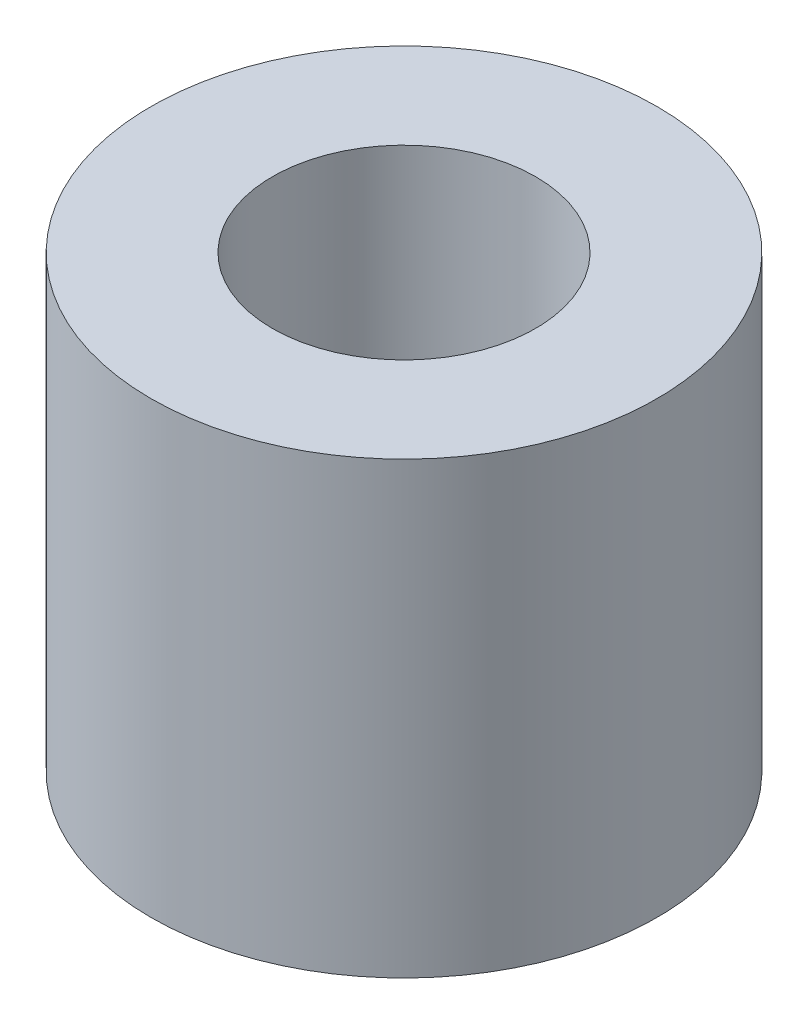
ISO-10303-21;
HEADER;
FILE_DESCRIPTION(('STEP AP214'),'2;1');
FILE_NAME('part.step','',(''),(''),'','','');
FILE_SCHEMA(('AUTOMOTIVE_DESIGN { 1 0 10303 214 1 1 1 1 }'));
ENDSEC;
DATA;
#1=APPLICATION_CONTEXT('core data for automotive mechanical design processes');
#2=APPLICATION_PROTOCOL_DEFINITION('international standard','automotive_design',2000,#1);
#3=PRODUCT_CONTEXT('',#1,'mechanical');
#4=PRODUCT('Part','Part','',(#3));
#5=PRODUCT_RELATED_PRODUCT_CATEGORY('part','',(#4));
#6=PRODUCT_DEFINITION_FORMATION('','',#4);
#7=PRODUCT_DEFINITION_CONTEXT('part definition',#1,'design');
#8=PRODUCT_DEFINITION('design','',#6,#7);
#9=PRODUCT_DEFINITION_SHAPE('','',#8);
#10=(LENGTH_UNIT() NAMED_UNIT(*) SI_UNIT(.MILLI.,.METRE.));
#11=(NAMED_UNIT(*) PLANE_ANGLE_UNIT() SI_UNIT($,.RADIAN.));
#12=(NAMED_UNIT(*) SI_UNIT($,.STERADIAN.) SOLID_ANGLE_UNIT());
#13=UNCERTAINTY_MEASURE_WITH_UNIT(LENGTH_MEASURE(1.E-05),#10,'distance_accuracy_value','');
#14=(GEOMETRIC_REPRESENTATION_CONTEXT(3) GLOBAL_UNCERTAINTY_ASSIGNED_CONTEXT((#13)) GLOBAL_UNIT_ASSIGNED_CONTEXT((#10,
#11,#12)) REPRESENTATION_CONTEXT('',''));
#15=CARTESIAN_POINT('',(0.,0.,0.));
#16=DIRECTION('',(0.,0.,1.));
#17=DIRECTION('',(1.,0.,0.));
#18=AXIS2_PLACEMENT_3D('',#15,#16,#17);
#19=CARTESIAN_POINT('',(0.,11.1,0.));
#20=DIRECTION('',(0.,1.,0.));
#21=DIRECTION('',(0.,0.,1.));
#22=AXIS2_PLACEMENT_3D('',#19,#20,#21);
#23=PLANE('',#22);
#24=CARTESIAN_POINT('',(0.,11.1,0.));
#25=DIRECTION('',(0.,1.,0.));
#26=DIRECTION('',(0.,0.,1.));
#27=AXIS2_PLACEMENT_3D('',#24,#25,#26);
#28=CIRCLE('',#27,6.25);
#29=CARTESIAN_POINT('',(0.,11.1,6.25));
#30=VERTEX_POINT('',#29);
#31=EDGE_CURVE('E10',#30,#30,#28,.T.);
#32=ORIENTED_EDGE('',*,*,#31,.T.);
#33=EDGE_LOOP('',(#32));
#34=FACE_BOUND('',#33,.T.);
#35=CARTESIAN_POINT('',(0.,11.1,0.));
#36=DIRECTION('',(0.,1.,0.));
#37=DIRECTION('',(0.,0.,1.));
#38=AXIS2_PLACEMENT_3D('',#35,#36,#37);
#39=CIRCLE('',#38,3.25);
#40=CARTESIAN_POINT('',(0.,11.1,3.25));
#41=VERTEX_POINT('',#40);
#42=EDGE_CURVE('E45',#41,#41,#39,.T.);
#43=ORIENTED_EDGE('',*,*,#42,.F.);
#44=EDGE_LOOP('',(#43));
#45=FACE_BOUND('',#44,.T.);
#46=ADVANCED_FACE('F34',(#34,#45),#23,.T.);
#47=CARTESIAN_POINT('',(0.,0.,0.));
#48=DIRECTION('',(0.,1.,0.));
#49=DIRECTION('',(0.,0.,1.));
#50=AXIS2_PLACEMENT_3D('',#47,#48,#49);
#51=PLANE('',#50);
#52=CARTESIAN_POINT('',(0.,0.,0.));
#53=DIRECTION('',(0.,1.,0.));
#54=DIRECTION('',(0.,0.,1.));
#55=AXIS2_PLACEMENT_3D('',#52,#53,#54);
#56=CIRCLE('',#55,6.25);
#57=CARTESIAN_POINT('',(0.,0.,6.25));
#58=VERTEX_POINT('',#57);
#59=EDGE_CURVE('E38',#58,#58,#56,.T.);
#60=ORIENTED_EDGE('',*,*,#59,.F.);
#61=EDGE_LOOP('',(#60));
#62=FACE_BOUND('',#61,.T.);
#63=CARTESIAN_POINT('',(0.,0.,0.));
#64=DIRECTION('',(0.,1.,0.));
#65=DIRECTION('',(0.,0.,1.));
#66=AXIS2_PLACEMENT_3D('',#63,#64,#65);
#67=CIRCLE('',#66,3.25);
#68=CARTESIAN_POINT('',(0.,0.,3.25));
#69=VERTEX_POINT('',#68);
#70=EDGE_CURVE('E47',#69,#69,#67,.T.);
#71=ORIENTED_EDGE('',*,*,#70,.T.);
#72=EDGE_LOOP('',(#71));
#73=FACE_BOUND('',#72,.T.);
#74=ADVANCED_FACE('F57',(#62,#73),#51,.F.);
#75=CARTESIAN_POINT('',(0.,11.1,0.));
#76=DIRECTION('',(0.,-1.,0.));
#77=DIRECTION('',(0.,0.,-1.));
#78=AXIS2_PLACEMENT_3D('',#75,#76,#77);
#79=CYLINDRICAL_SURFACE('',#78,6.25);
#80=ORIENTED_EDGE('',*,*,#31,.F.);
#81=EDGE_LOOP('',(#80));
#82=FACE_BOUND('',#81,.T.);
#83=ORIENTED_EDGE('',*,*,#59,.T.);
#84=EDGE_LOOP('',(#83));
#85=FACE_BOUND('',#84,.T.);
#86=ADVANCED_FACE('F36',(#82,#85),#79,.T.);
#87=CARTESIAN_POINT('',(0.,11.1,0.));
#88=DIRECTION('',(0.,-1.,0.));
#89=DIRECTION('',(0.,0.,-1.));
#90=AXIS2_PLACEMENT_3D('',#87,#88,#89);
#91=CYLINDRICAL_SURFACE('',#90,3.25);
#92=ORIENTED_EDGE('',*,*,#42,.T.);
#93=EDGE_LOOP('',(#92));
#94=FACE_BOUND('',#93,.T.);
#95=ORIENTED_EDGE('',*,*,#70,.F.);
#96=EDGE_LOOP('',(#95));
#97=FACE_BOUND('',#96,.T.);
#98=ADVANCED_FACE('F53',(#94,#97),#91,.F.);
#99=CLOSED_SHELL('',(#46,#74,#86,#98));
#100=MANIFOLD_SOLID_BREP('B2',#99);
#101=ADVANCED_BREP_SHAPE_REPRESENTATION('',(#18,#100),#14);
#102=SHAPE_DEFINITION_REPRESENTATION(#9,#101);
ENDSEC;
END-ISO-10303-21;
